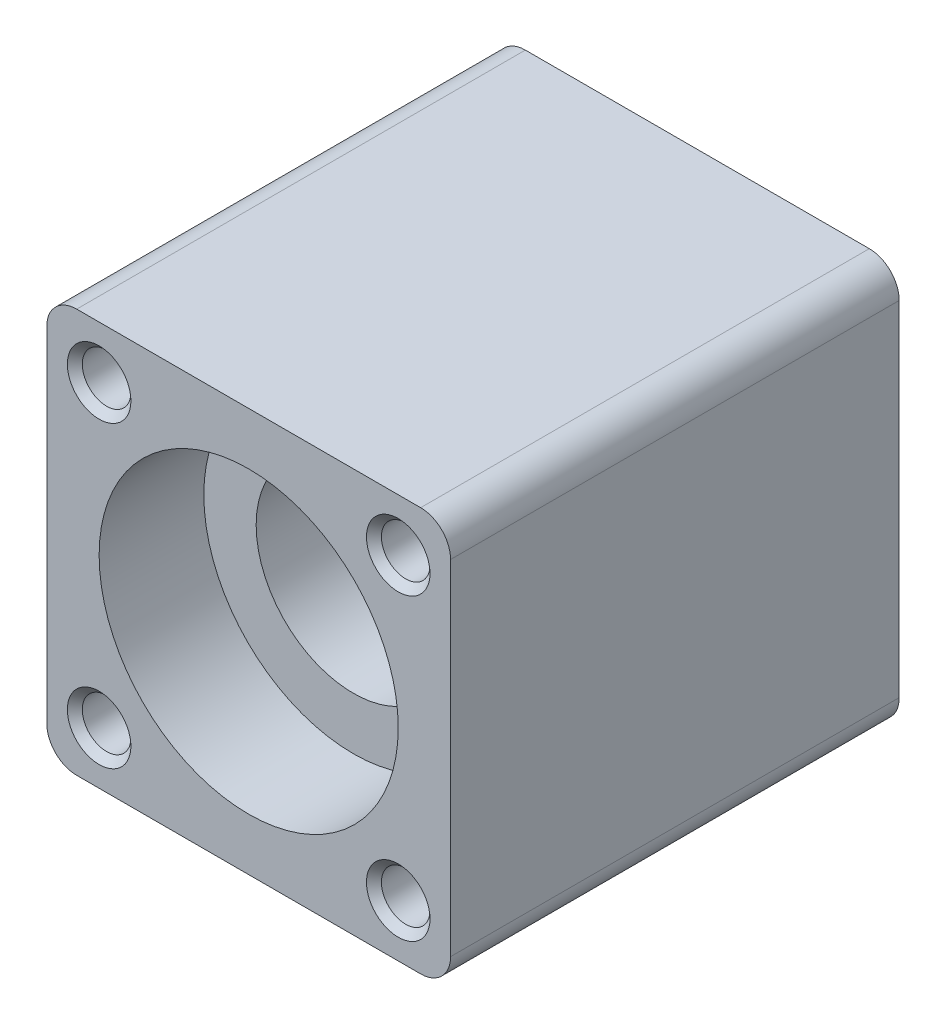
ISO-10303-21;
HEADER;
FILE_DESCRIPTION(('STEP AP214'),'2;1');
FILE_NAME('part.step','',(''),(''),'','','');
FILE_SCHEMA(('AUTOMOTIVE_DESIGN { 1 0 10303 214 1 1 1 1 }'));
ENDSEC;
DATA;
#1=APPLICATION_CONTEXT('core data for automotive mechanical design processes');
#2=APPLICATION_PROTOCOL_DEFINITION('international standard','automotive_design',2000,#1);
#3=PRODUCT_CONTEXT('',#1,'mechanical');
#4=PRODUCT('Part','Part','',(#3));
#5=PRODUCT_RELATED_PRODUCT_CATEGORY('part','',(#4));
#6=PRODUCT_DEFINITION_FORMATION('','',#4);
#7=PRODUCT_DEFINITION_CONTEXT('part definition',#1,'design');
#8=PRODUCT_DEFINITION('design','',#6,#7);
#9=PRODUCT_DEFINITION_SHAPE('','',#8);
#10=(LENGTH_UNIT() NAMED_UNIT(*) SI_UNIT(.MILLI.,.METRE.));
#11=(NAMED_UNIT(*) PLANE_ANGLE_UNIT() SI_UNIT($,.RADIAN.));
#12=(NAMED_UNIT(*) SI_UNIT($,.STERADIAN.) SOLID_ANGLE_UNIT());
#13=UNCERTAINTY_MEASURE_WITH_UNIT(LENGTH_MEASURE(1.E-05),#10,'distance_accuracy_value','');
#14=(GEOMETRIC_REPRESENTATION_CONTEXT(3) GLOBAL_UNCERTAINTY_ASSIGNED_CONTEXT((#13)) GLOBAL_UNIT_ASSIGNED_CONTEXT((#10,
#11,#12)) REPRESENTATION_CONTEXT('',''));
#15=CARTESIAN_POINT('',(0.,0.,0.));
#16=DIRECTION('',(0.,0.,1.));
#17=DIRECTION('',(1.,0.,0.));
#18=AXIS2_PLACEMENT_3D('',#15,#16,#17);
#19=CARTESIAN_POINT('',(0.,0.,0.));
#20=DIRECTION('',(0.,0.,1.));
#21=DIRECTION('',(1.,0.,0.));
#22=AXIS2_PLACEMENT_3D('',#19,#20,#21);
#23=CYLINDRICAL_SURFACE('',#22,13.);
#24=CARTESIAN_POINT('',(0.,0.,46.));
#25=DIRECTION('',(0.,0.,1.));
#26=DIRECTION('',(1.,0.,0.));
#27=AXIS2_PLACEMENT_3D('',#24,#25,#26);
#28=CIRCLE('',#27,13.);
#29=CARTESIAN_POINT('',(13.,0.,46.));
#30=VERTEX_POINT('',#29);
#31=EDGE_CURVE('E135',#30,#30,#28,.F.);
#32=ORIENTED_EDGE('',*,*,#31,.F.);
#33=EDGE_LOOP('',(#32));
#34=FACE_BOUND('',#33,.T.);
#35=CARTESIAN_POINT('',(0.,0.,12.));
#36=DIRECTION('',(0.,0.,-1.));
#37=DIRECTION('',(-1.,0.,0.));
#38=AXIS2_PLACEMENT_3D('',#35,#36,#37);
#39=CIRCLE('',#38,13.);
#40=CARTESIAN_POINT('',(-13.,0.,12.));
#41=VERTEX_POINT('',#40);
#42=EDGE_CURVE('E140',#41,#41,#39,.F.);
#43=ORIENTED_EDGE('',*,*,#42,.F.);
#44=EDGE_LOOP('',(#43));
#45=FACE_BOUND('',#44,.T.);
#46=ADVANCED_FACE('F33',(#34,#45),#23,.F.);
#47=CARTESIAN_POINT('',(27.,27.,60.));
#48=DIRECTION('',(-1.,0.,0.));
#49=DIRECTION('',(0.,-1.,0.));
#50=AXIS2_PLACEMENT_3D('',#47,#48,#49);
#51=PLANE('',#50);
#52=DIRECTION('',(0.,1.,0.));
#53=VECTOR('',#52,1.);
#54=CARTESIAN_POINT('',(27.,27.,60.));
#55=LINE('',#54,#53);
#56=CARTESIAN_POINT('',(27.,-23.,60.));
#57=VERTEX_POINT('',#56);
#58=CARTESIAN_POINT('',(27.,23.,60.));
#59=VERTEX_POINT('',#58);
#60=EDGE_CURVE('E126',#57,#59,#55,.T.);
#61=ORIENTED_EDGE('',*,*,#60,.F.);
#62=DIRECTION('',(0.,0.,-1.));
#63=VECTOR('',#62,1.);
#64=CARTESIAN_POINT('',(27.,-23.,60.));
#65=LINE('',#64,#63);
#66=CARTESIAN_POINT('',(27.,-23.,0.));
#67=VERTEX_POINT('',#66);
#68=EDGE_CURVE('E162',#57,#67,#65,.T.);
#69=ORIENTED_EDGE('',*,*,#68,.T.);
#70=DIRECTION('',(0.,1.,0.));
#71=VECTOR('',#70,1.);
#72=CARTESIAN_POINT('',(27.,27.,0.));
#73=LINE('',#72,#71);
#74=CARTESIAN_POINT('',(27.,23.,0.));
#75=VERTEX_POINT('',#74);
#76=EDGE_CURVE('E138',#67,#75,#73,.T.);
#77=ORIENTED_EDGE('',*,*,#76,.T.);
#78=DIRECTION('',(0.,0.,-1.));
#79=VECTOR('',#78,1.);
#80=CARTESIAN_POINT('',(27.,23.,60.));
#81=LINE('',#80,#79);
#82=EDGE_CURVE('E160',#75,#59,#81,.F.);
#83=ORIENTED_EDGE('',*,*,#82,.T.);
#84=EDGE_LOOP('',(#61,#69,#77,#83));
#85=FACE_BOUND('',#84,.T.);
#86=ADVANCED_FACE('F206',(#85),#51,.F.);
#87=CARTESIAN_POINT('',(-27.,27.,60.));
#88=DIRECTION('',(0.,-1.,0.));
#89=DIRECTION('',(0.,0.,-1.));
#90=AXIS2_PLACEMENT_3D('',#87,#88,#89);
#91=PLANE('',#90);
#92=DIRECTION('',(-1.,0.,0.));
#93=VECTOR('',#92,1.);
#94=CARTESIAN_POINT('',(-27.,27.,60.));
#95=LINE('',#94,#93);
#96=CARTESIAN_POINT('',(23.,27.,60.));
#97=VERTEX_POINT('',#96);
#98=CARTESIAN_POINT('',(-23.,27.,60.));
#99=VERTEX_POINT('',#98);
#100=EDGE_CURVE('E129',#97,#99,#95,.T.);
#101=ORIENTED_EDGE('',*,*,#100,.F.);
#102=DIRECTION('',(0.,0.,-1.));
#103=VECTOR('',#102,1.);
#104=CARTESIAN_POINT('',(23.,27.,60.));
#105=LINE('',#104,#103);
#106=CARTESIAN_POINT('',(23.,27.,0.));
#107=VERTEX_POINT('',#106);
#108=EDGE_CURVE('E166',#97,#107,#105,.T.);
#109=ORIENTED_EDGE('',*,*,#108,.T.);
#110=DIRECTION('',(-1.,0.,0.));
#111=VECTOR('',#110,1.);
#112=CARTESIAN_POINT('',(-27.,27.,0.));
#113=LINE('',#112,#111);
#114=CARTESIAN_POINT('',(-23.,27.,0.));
#115=VERTEX_POINT('',#114);
#116=EDGE_CURVE('E131',#107,#115,#113,.T.);
#117=ORIENTED_EDGE('',*,*,#116,.T.);
#118=DIRECTION('',(0.,0.,-1.));
#119=VECTOR('',#118,1.);
#120=CARTESIAN_POINT('',(-23.,27.,60.));
#121=LINE('',#120,#119);
#122=EDGE_CURVE('E48',#115,#99,#121,.F.);
#123=ORIENTED_EDGE('',*,*,#122,.T.);
#124=EDGE_LOOP('',(#101,#109,#117,#123));
#125=FACE_BOUND('',#124,.T.);
#126=ADVANCED_FACE('F212',(#125),#91,.F.);
#127=CARTESIAN_POINT('',(-27.,27.,60.));
#128=DIRECTION('',(1.,0.,0.));
#129=DIRECTION('',(0.,1.,0.));
#130=AXIS2_PLACEMENT_3D('',#127,#128,#129);
#131=PLANE('',#130);
#132=DIRECTION('',(0.,-1.,0.));
#133=VECTOR('',#132,1.);
#134=CARTESIAN_POINT('',(-27.,27.,0.));
#135=LINE('',#134,#133);
#136=CARTESIAN_POINT('',(-27.,23.,0.));
#137=VERTEX_POINT('',#136);
#138=CARTESIAN_POINT('',(-27.,-23.,0.));
#139=VERTEX_POINT('',#138);
#140=EDGE_CURVE('E127',#137,#139,#135,.T.);
#141=ORIENTED_EDGE('',*,*,#140,.T.);
#142=DIRECTION('',(0.,0.,-1.));
#143=VECTOR('',#142,1.);
#144=CARTESIAN_POINT('',(-27.,-23.,60.));
#145=LINE('',#144,#143);
#146=CARTESIAN_POINT('',(-27.,-23.,60.));
#147=VERTEX_POINT('',#146);
#148=EDGE_CURVE('E105',#139,#147,#145,.F.);
#149=ORIENTED_EDGE('',*,*,#148,.T.);
#150=DIRECTION('',(0.,-1.,0.));
#151=VECTOR('',#150,1.);
#152=CARTESIAN_POINT('',(-27.,27.,60.));
#153=LINE('',#152,#151);
#154=CARTESIAN_POINT('',(-27.,23.,60.));
#155=VERTEX_POINT('',#154);
#156=EDGE_CURVE('E290',#155,#147,#153,.T.);
#157=ORIENTED_EDGE('',*,*,#156,.F.);
#158=DIRECTION('',(0.,0.,-1.));
#159=VECTOR('',#158,1.);
#160=CARTESIAN_POINT('',(-27.,23.,60.));
#161=LINE('',#160,#159);
#162=EDGE_CURVE('E110',#155,#137,#161,.T.);
#163=ORIENTED_EDGE('',*,*,#162,.T.);
#164=EDGE_LOOP('',(#141,#149,#157,#163));
#165=FACE_BOUND('',#164,.T.);
#166=ADVANCED_FACE('F231',(#165),#131,.F.);
#167=CARTESIAN_POINT('',(-27.,-27.,60.));
#168=DIRECTION('',(0.,1.,0.));
#169=DIRECTION('',(0.,0.,1.));
#170=AXIS2_PLACEMENT_3D('',#167,#168,#169);
#171=PLANE('',#170);
#172=DIRECTION('',(1.,0.,0.));
#173=VECTOR('',#172,1.);
#174=CARTESIAN_POINT('',(-27.,-27.,60.));
#175=LINE('',#174,#173);
#176=CARTESIAN_POINT('',(-23.,-27.,60.));
#177=VERTEX_POINT('',#176);
#178=CARTESIAN_POINT('',(23.,-27.,60.));
#179=VERTEX_POINT('',#178);
#180=EDGE_CURVE('E120',#177,#179,#175,.T.);
#181=ORIENTED_EDGE('',*,*,#180,.F.);
#182=DIRECTION('',(0.,0.,-1.));
#183=VECTOR('',#182,1.);
#184=CARTESIAN_POINT('',(-23.,-27.,60.));
#185=LINE('',#184,#183);
#186=CARTESIAN_POINT('',(-23.,-27.,0.));
#187=VERTEX_POINT('',#186);
#188=EDGE_CURVE('E104',#177,#187,#185,.T.);
#189=ORIENTED_EDGE('',*,*,#188,.T.);
#190=DIRECTION('',(1.,0.,0.));
#191=VECTOR('',#190,1.);
#192=CARTESIAN_POINT('',(-27.,-27.,0.));
#193=LINE('',#192,#191);
#194=CARTESIAN_POINT('',(23.,-27.,0.));
#195=VERTEX_POINT('',#194);
#196=EDGE_CURVE('E117',#187,#195,#193,.T.);
#197=ORIENTED_EDGE('',*,*,#196,.T.);
#198=DIRECTION('',(0.,0.,-1.));
#199=VECTOR('',#198,1.);
#200=CARTESIAN_POINT('',(23.,-27.,60.));
#201=LINE('',#200,#199);
#202=EDGE_CURVE('E122',#195,#179,#201,.F.);
#203=ORIENTED_EDGE('',*,*,#202,.T.);
#204=EDGE_LOOP('',(#181,#189,#197,#203));
#205=FACE_BOUND('',#204,.T.);
#206=ADVANCED_FACE('F116',(#205),#171,.F.);
#207=CARTESIAN_POINT('',(0.,0.,60.));
#208=DIRECTION('',(0.,0.,1.));
#209=DIRECTION('',(1.,0.,0.));
#210=AXIS2_PLACEMENT_3D('',#207,#208,#209);
#211=PLANE('',#210);
#212=CARTESIAN_POINT('',(-19.9999999999989,-20.0000000000011,60.));
#213=DIRECTION('',(0.,0.,1.));
#214=DIRECTION('',(1.,0.,0.));
#215=AXIS2_PLACEMENT_3D('',#212,#213,#214);
#216=CIRCLE('',#215,4.25000000000085);
#217=CARTESIAN_POINT('',(-15.749999999998,-20.0000000000011,60.));
#218=VERTEX_POINT('',#217);
#219=EDGE_CURVE('E181',#218,#218,#216,.F.);
#220=ORIENTED_EDGE('',*,*,#219,.T.);
#221=EDGE_LOOP('',(#220));
#222=FACE_BOUND('',#221,.T.);
#223=CARTESIAN_POINT('',(20.0000000000011,-20.,60.));
#224=DIRECTION('',(0.,0.,1.));
#225=DIRECTION('',(1.,0.,0.));
#226=AXIS2_PLACEMENT_3D('',#223,#224,#225);
#227=CIRCLE('',#226,4.24999999999971);
#228=CARTESIAN_POINT('',(24.2500000000008,-20.,60.));
#229=VERTEX_POINT('',#228);
#230=EDGE_CURVE('E178',#229,#229,#227,.F.);
#231=ORIENTED_EDGE('',*,*,#230,.T.);
#232=EDGE_LOOP('',(#231));
#233=FACE_BOUND('',#232,.T.);
#234=CARTESIAN_POINT('',(20.,20.,60.));
#235=DIRECTION('',(0.,0.,1.));
#236=DIRECTION('',(1.,0.,0.));
#237=AXIS2_PLACEMENT_3D('',#234,#235,#236);
#238=CIRCLE('',#237,4.25000000000003);
#239=CARTESIAN_POINT('',(24.25,20.,60.));
#240=VERTEX_POINT('',#239);
#241=EDGE_CURVE('E175',#240,#240,#238,.F.);
#242=ORIENTED_EDGE('',*,*,#241,.T.);
#243=EDGE_LOOP('',(#242));
#244=FACE_BOUND('',#243,.T.);
#245=CARTESIAN_POINT('',(-20.,19.9999999999989,60.));
#246=DIRECTION('',(0.,0.,1.));
#247=DIRECTION('',(1.,0.,0.));
#248=AXIS2_PLACEMENT_3D('',#245,#246,#247);
#249=CIRCLE('',#248,4.25000000000124);
#250=CARTESIAN_POINT('',(-15.7499999999988,19.9999999999989,60.));
#251=VERTEX_POINT('',#250);
#252=EDGE_CURVE('E172',#251,#251,#249,.F.);
#253=ORIENTED_EDGE('',*,*,#252,.T.);
#254=EDGE_LOOP('',(#253));
#255=FACE_BOUND('',#254,.T.);
#256=CARTESIAN_POINT('',(0.,0.,60.));
#257=DIRECTION('',(0.,0.,1.));
#258=DIRECTION('',(1.,0.,0.));
#259=AXIS2_PLACEMENT_3D('',#256,#257,#258);
#260=CIRCLE('',#259,20.);
#261=CARTESIAN_POINT('',(20.,0.,60.));
#262=VERTEX_POINT('',#261);
#263=EDGE_CURVE('E143',#262,#262,#260,.T.);
#264=ORIENTED_EDGE('',*,*,#263,.F.);
#265=EDGE_LOOP('',(#264));
#266=FACE_BOUND('',#265,.T.);
#267=ORIENTED_EDGE('',*,*,#156,.T.);
#268=CARTESIAN_POINT('',(-23.,-23.,60.));
#269=DIRECTION('',(0.,0.,1.));
#270=DIRECTION('',(1.,0.,0.));
#271=AXIS2_PLACEMENT_3D('',#268,#269,#270);
#272=CIRCLE('',#271,4.);
#273=EDGE_CURVE('E158',#147,#177,#272,.T.);
#274=ORIENTED_EDGE('',*,*,#273,.T.);
#275=ORIENTED_EDGE('',*,*,#180,.T.);
#276=CARTESIAN_POINT('',(23.,-23.,60.));
#277=DIRECTION('',(0.,0.,1.));
#278=DIRECTION('',(1.,0.,0.));
#279=AXIS2_PLACEMENT_3D('',#276,#277,#278);
#280=CIRCLE('',#279,4.);
#281=EDGE_CURVE('E156',#179,#57,#280,.T.);
#282=ORIENTED_EDGE('',*,*,#281,.T.);
#283=ORIENTED_EDGE('',*,*,#60,.T.);
#284=CARTESIAN_POINT('',(23.,23.,60.));
#285=DIRECTION('',(0.,0.,1.));
#286=DIRECTION('',(1.,0.,0.));
#287=AXIS2_PLACEMENT_3D('',#284,#285,#286);
#288=CIRCLE('',#287,4.);
#289=EDGE_CURVE('E55',#59,#97,#288,.T.);
#290=ORIENTED_EDGE('',*,*,#289,.T.);
#291=ORIENTED_EDGE('',*,*,#100,.T.);
#292=CARTESIAN_POINT('',(-23.,23.,60.));
#293=DIRECTION('',(0.,0.,1.));
#294=DIRECTION('',(1.,0.,0.));
#295=AXIS2_PLACEMENT_3D('',#292,#293,#294);
#296=CIRCLE('',#295,4.);
#297=EDGE_CURVE('E153',#99,#155,#296,.T.);
#298=ORIENTED_EDGE('',*,*,#297,.T.);
#299=EDGE_LOOP('',(#267,#274,#275,#282,#283,#290,#291,#298));
#300=FACE_BOUND('',#299,.T.);
#301=ADVANCED_FACE('F221',(#222,#233,#244,#255,#266,#300),#211,.T.);
#302=CARTESIAN_POINT('',(0.,0.,0.));
#303=DIRECTION('',(0.,0.,1.));
#304=DIRECTION('',(1.,0.,0.));
#305=AXIS2_PLACEMENT_3D('',#302,#303,#304);
#306=PLANE('',#305);
#307=CARTESIAN_POINT('',(-20.,19.9999999999989,0.));
#308=DIRECTION('',(0.,0.,1.));
#309=DIRECTION('',(1.,0.,0.));
#310=AXIS2_PLACEMENT_3D('',#307,#308,#309);
#311=CIRCLE('',#310,3.25000000000121);
#312=CARTESIAN_POINT('',(-16.7499999999988,19.9999999999989,0.));
#313=VERTEX_POINT('',#312);
#314=EDGE_CURVE('E270',#313,#313,#311,.T.);
#315=ORIENTED_EDGE('',*,*,#314,.T.);
#316=EDGE_LOOP('',(#315));
#317=FACE_BOUND('',#316,.T.);
#318=CARTESIAN_POINT('',(-19.9999999999989,-20.0000000000011,0.));
#319=DIRECTION('',(0.,0.,1.));
#320=DIRECTION('',(1.,0.,0.));
#321=AXIS2_PLACEMENT_3D('',#318,#319,#320);
#322=CIRCLE('',#321,3.25000000000083);
#323=CARTESIAN_POINT('',(-16.749999999998,-20.0000000000011,0.));
#324=VERTEX_POINT('',#323);
#325=EDGE_CURVE('E267',#324,#324,#322,.T.);
#326=ORIENTED_EDGE('',*,*,#325,.T.);
#327=EDGE_LOOP('',(#326));
#328=FACE_BOUND('',#327,.T.);
#329=CARTESIAN_POINT('',(20.0000000000011,-20.,0.));
#330=DIRECTION('',(0.,0.,1.));
#331=DIRECTION('',(1.,0.,0.));
#332=AXIS2_PLACEMENT_3D('',#329,#330,#331);
#333=CIRCLE('',#332,3.24999999999972);
#334=CARTESIAN_POINT('',(23.2500000000008,-20.,0.));
#335=VERTEX_POINT('',#334);
#336=EDGE_CURVE('E269',#335,#335,#333,.T.);
#337=ORIENTED_EDGE('',*,*,#336,.T.);
#338=EDGE_LOOP('',(#337));
#339=FACE_BOUND('',#338,.T.);
#340=CARTESIAN_POINT('',(20.,20.,0.));
#341=DIRECTION('',(0.,0.,1.));
#342=DIRECTION('',(1.,0.,0.));
#343=AXIS2_PLACEMENT_3D('',#340,#341,#342);
#344=CIRCLE('',#343,3.25);
#345=CARTESIAN_POINT('',(23.25,20.,0.));
#346=VERTEX_POINT('',#345);
#347=EDGE_CURVE('E273',#346,#346,#344,.T.);
#348=ORIENTED_EDGE('',*,*,#347,.T.);
#349=EDGE_LOOP('',(#348));
#350=FACE_BOUND('',#349,.T.);
#351=CARTESIAN_POINT('',(0.,0.,0.));
#352=DIRECTION('',(0.,0.,-1.));
#353=DIRECTION('',(-1.,0.,0.));
#354=AXIS2_PLACEMENT_3D('',#351,#352,#353);
#355=CIRCLE('',#354,20.);
#356=CARTESIAN_POINT('',(-20.,0.,0.));
#357=VERTEX_POINT('',#356);
#358=EDGE_CURVE('E280',#357,#357,#355,.T.);
#359=ORIENTED_EDGE('',*,*,#358,.F.);
#360=EDGE_LOOP('',(#359));
#361=FACE_BOUND('',#360,.T.);
#362=ORIENTED_EDGE('',*,*,#196,.F.);
#363=CARTESIAN_POINT('',(-23.,-23.,0.));
#364=DIRECTION('',(0.,0.,1.));
#365=DIRECTION('',(1.,0.,0.));
#366=AXIS2_PLACEMENT_3D('',#363,#364,#365);
#367=CIRCLE('',#366,4.);
#368=EDGE_CURVE('E100',#187,#139,#367,.F.);
#369=ORIENTED_EDGE('',*,*,#368,.T.);
#370=ORIENTED_EDGE('',*,*,#140,.F.);
#371=CARTESIAN_POINT('',(-23.,23.,0.));
#372=DIRECTION('',(0.,0.,1.));
#373=DIRECTION('',(1.,0.,0.));
#374=AXIS2_PLACEMENT_3D('',#371,#372,#373);
#375=CIRCLE('',#374,4.);
#376=EDGE_CURVE('E121',#137,#115,#375,.F.);
#377=ORIENTED_EDGE('',*,*,#376,.T.);
#378=ORIENTED_EDGE('',*,*,#116,.F.);
#379=CARTESIAN_POINT('',(23.,23.,0.));
#380=DIRECTION('',(0.,0.,1.));
#381=DIRECTION('',(1.,0.,0.));
#382=AXIS2_PLACEMENT_3D('',#379,#380,#381);
#383=CIRCLE('',#382,4.);
#384=EDGE_CURVE('E147',#107,#75,#383,.F.);
#385=ORIENTED_EDGE('',*,*,#384,.T.);
#386=ORIENTED_EDGE('',*,*,#76,.F.);
#387=CARTESIAN_POINT('',(23.,-23.,0.));
#388=DIRECTION('',(0.,0.,1.));
#389=DIRECTION('',(1.,0.,0.));
#390=AXIS2_PLACEMENT_3D('',#387,#388,#389);
#391=CIRCLE('',#390,4.);
#392=EDGE_CURVE('E111',#67,#195,#391,.F.);
#393=ORIENTED_EDGE('',*,*,#392,.T.);
#394=EDGE_LOOP('',(#362,#369,#370,#377,#378,#385,#386,#393));
#395=FACE_BOUND('',#394,.T.);
#396=ADVANCED_FACE('F124',(#317,#328,#339,#350,#361,#395),#306,.F.);
#397=CARTESIAN_POINT('',(0.,0.,46.));
#398=DIRECTION('',(0.,0.,1.));
#399=DIRECTION('',(1.,0.,0.));
#400=AXIS2_PLACEMENT_3D('',#397,#398,#399);
#401=PLANE('',#400);
#402=CARTESIAN_POINT('',(0.,0.,46.));
#403=DIRECTION('',(0.,0.,1.));
#404=DIRECTION('',(1.,0.,0.));
#405=AXIS2_PLACEMENT_3D('',#402,#403,#404);
#406=CIRCLE('',#405,20.);
#407=CARTESIAN_POINT('',(20.,0.,46.));
#408=VERTEX_POINT('',#407);
#409=EDGE_CURVE('E139',#408,#408,#406,.T.);
#410=ORIENTED_EDGE('',*,*,#409,.T.);
#411=EDGE_LOOP('',(#410));
#412=FACE_BOUND('',#411,.T.);
#413=ORIENTED_EDGE('',*,*,#31,.T.);
#414=EDGE_LOOP('',(#413));
#415=FACE_BOUND('',#414,.T.);
#416=ADVANCED_FACE('F227',(#412,#415),#401,.T.);
#417=CARTESIAN_POINT('',(0.,0.,46.));
#418=DIRECTION('',(0.,0.,1.));
#419=DIRECTION('',(1.,0.,0.));
#420=AXIS2_PLACEMENT_3D('',#417,#418,#419);
#421=CYLINDRICAL_SURFACE('',#420,20.);
#422=ORIENTED_EDGE('',*,*,#409,.F.);
#423=EDGE_LOOP('',(#422));
#424=FACE_BOUND('',#423,.T.);
#425=ORIENTED_EDGE('',*,*,#263,.T.);
#426=EDGE_LOOP('',(#425));
#427=FACE_BOUND('',#426,.T.);
#428=ADVANCED_FACE('F219',(#424,#427),#421,.F.);
#429=CARTESIAN_POINT('',(0.,0.,12.));
#430=DIRECTION('',(0.,0.,-1.));
#431=DIRECTION('',(-1.,0.,0.));
#432=AXIS2_PLACEMENT_3D('',#429,#430,#431);
#433=PLANE('',#432);
#434=CARTESIAN_POINT('',(0.,0.,12.));
#435=DIRECTION('',(0.,0.,-1.));
#436=DIRECTION('',(-1.,0.,0.));
#437=AXIS2_PLACEMENT_3D('',#434,#435,#436);
#438=CIRCLE('',#437,20.);
#439=CARTESIAN_POINT('',(-20.,0.,12.));
#440=VERTEX_POINT('',#439);
#441=EDGE_CURVE('E144',#440,#440,#438,.T.);
#442=ORIENTED_EDGE('',*,*,#441,.T.);
#443=EDGE_LOOP('',(#442));
#444=FACE_BOUND('',#443,.T.);
#445=ORIENTED_EDGE('',*,*,#42,.T.);
#446=EDGE_LOOP('',(#445));
#447=FACE_BOUND('',#446,.T.);
#448=ADVANCED_FACE('F308',(#444,#447),#433,.T.);
#449=CARTESIAN_POINT('',(0.,0.,12.));
#450=DIRECTION('',(0.,0.,-1.));
#451=DIRECTION('',(-1.,0.,0.));
#452=AXIS2_PLACEMENT_3D('',#449,#450,#451);
#453=CYLINDRICAL_SURFACE('',#452,20.);
#454=ORIENTED_EDGE('',*,*,#441,.F.);
#455=EDGE_LOOP('',(#454));
#456=FACE_BOUND('',#455,.T.);
#457=ORIENTED_EDGE('',*,*,#358,.T.);
#458=EDGE_LOOP('',(#457));
#459=FACE_BOUND('',#458,.T.);
#460=ADVANCED_FACE('F314',(#456,#459),#453,.F.);
#461=CARTESIAN_POINT('',(20.,20.,0.));
#462=DIRECTION('',(0.,0.,1.));
#463=DIRECTION('',(1.,0.,0.));
#464=AXIS2_PLACEMENT_3D('',#461,#462,#463);
#465=CYLINDRICAL_SURFACE('',#464,3.25);
#466=CARTESIAN_POINT('',(20.,20.,59.));
#467=DIRECTION('',(0.,0.,1.));
#468=DIRECTION('',(1.,0.,0.));
#469=AXIS2_PLACEMENT_3D('',#466,#467,#468);
#470=CIRCLE('',#469,3.25);
#471=CARTESIAN_POINT('',(23.25,20.,59.));
#472=VERTEX_POINT('',#471);
#473=EDGE_CURVE('E41',#472,#472,#470,.T.);
#474=ORIENTED_EDGE('',*,*,#473,.T.);
#475=EDGE_LOOP('',(#474));
#476=FACE_BOUND('',#475,.T.);
#477=ORIENTED_EDGE('',*,*,#347,.F.);
#478=EDGE_LOOP('',(#477));
#479=FACE_BOUND('',#478,.T.);
#480=ADVANCED_FACE('F189',(#476,#479),#465,.F.);
#481=CARTESIAN_POINT('',(20.0000000000011,-20.,0.));
#482=DIRECTION('',(0.,0.,1.));
#483=DIRECTION('',(1.,0.,0.));
#484=AXIS2_PLACEMENT_3D('',#481,#482,#483);
#485=CYLINDRICAL_SURFACE('',#484,3.24999999999972);
#486=CARTESIAN_POINT('',(20.0000000000011,-20.,59.));
#487=DIRECTION('',(0.,0.,1.));
#488=DIRECTION('',(1.,0.,0.));
#489=AXIS2_PLACEMENT_3D('',#486,#487,#488);
#490=CIRCLE('',#489,3.24999999999972);
#491=CARTESIAN_POINT('',(23.2500000000008,-20.,59.));
#492=VERTEX_POINT('',#491);
#493=EDGE_CURVE('E184',#492,#492,#490,.T.);
#494=ORIENTED_EDGE('',*,*,#493,.T.);
#495=EDGE_LOOP('',(#494));
#496=FACE_BOUND('',#495,.T.);
#497=ORIENTED_EDGE('',*,*,#336,.F.);
#498=EDGE_LOOP('',(#497));
#499=FACE_BOUND('',#498,.T.);
#500=ADVANCED_FACE('F263',(#496,#499),#485,.F.);
#501=CARTESIAN_POINT('',(-19.9999999999989,-20.0000000000011,0.));
#502=DIRECTION('',(0.,0.,1.));
#503=DIRECTION('',(1.,0.,0.));
#504=AXIS2_PLACEMENT_3D('',#501,#502,#503);
#505=CYLINDRICAL_SURFACE('',#504,3.25000000000083);
#506=CARTESIAN_POINT('',(-19.9999999999989,-20.0000000000011,59.));
#507=DIRECTION('',(0.,0.,1.));
#508=DIRECTION('',(1.,0.,0.));
#509=AXIS2_PLACEMENT_3D('',#506,#507,#508);
#510=CIRCLE('',#509,3.25000000000083);
#511=CARTESIAN_POINT('',(-16.749999999998,-20.0000000000011,59.));
#512=VERTEX_POINT('',#511);
#513=EDGE_CURVE('E169',#512,#512,#510,.T.);
#514=ORIENTED_EDGE('',*,*,#513,.T.);
#515=EDGE_LOOP('',(#514));
#516=FACE_BOUND('',#515,.T.);
#517=ORIENTED_EDGE('',*,*,#325,.F.);
#518=EDGE_LOOP('',(#517));
#519=FACE_BOUND('',#518,.T.);
#520=ADVANCED_FACE('F260',(#516,#519),#505,.F.);
#521=CARTESIAN_POINT('',(-20.,19.9999999999989,0.));
#522=DIRECTION('',(0.,0.,1.));
#523=DIRECTION('',(1.,0.,0.));
#524=AXIS2_PLACEMENT_3D('',#521,#522,#523);
#525=CYLINDRICAL_SURFACE('',#524,3.25000000000121);
#526=CARTESIAN_POINT('',(-20.,19.9999999999989,59.));
#527=DIRECTION('',(0.,0.,1.));
#528=DIRECTION('',(1.,0.,0.));
#529=AXIS2_PLACEMENT_3D('',#526,#527,#528);
#530=CIRCLE('',#529,3.25000000000121);
#531=CARTESIAN_POINT('',(-16.7499999999988,19.9999999999989,59.));
#532=VERTEX_POINT('',#531);
#533=EDGE_CURVE('E11',#532,#532,#530,.T.);
#534=ORIENTED_EDGE('',*,*,#533,.T.);
#535=EDGE_LOOP('',(#534));
#536=FACE_BOUND('',#535,.T.);
#537=ORIENTED_EDGE('',*,*,#314,.F.);
#538=EDGE_LOOP('',(#537));
#539=FACE_BOUND('',#538,.T.);
#540=ADVANCED_FACE('F240',(#536,#539),#525,.F.);
#541=CARTESIAN_POINT('',(-23.,-23.,60.));
#542=DIRECTION('',(0.,0.,-1.));
#543=DIRECTION('',(-1.,0.,0.));
#544=AXIS2_PLACEMENT_3D('',#541,#542,#543);
#545=CYLINDRICAL_SURFACE('',#544,4.);
#546=ORIENTED_EDGE('',*,*,#273,.F.);
#547=ORIENTED_EDGE('',*,*,#148,.F.);
#548=ORIENTED_EDGE('',*,*,#368,.F.);
#549=ORIENTED_EDGE('',*,*,#188,.F.);
#550=EDGE_LOOP('',(#546,#547,#548,#549));
#551=FACE_BOUND('',#550,.T.);
#552=ADVANCED_FACE('F103',(#551),#545,.T.);
#553=CARTESIAN_POINT('',(23.,-23.,60.));
#554=DIRECTION('',(0.,0.,-1.));
#555=DIRECTION('',(-1.,0.,0.));
#556=AXIS2_PLACEMENT_3D('',#553,#554,#555);
#557=CYLINDRICAL_SURFACE('',#556,4.);
#558=ORIENTED_EDGE('',*,*,#281,.F.);
#559=ORIENTED_EDGE('',*,*,#202,.F.);
#560=ORIENTED_EDGE('',*,*,#392,.F.);
#561=ORIENTED_EDGE('',*,*,#68,.F.);
#562=EDGE_LOOP('',(#558,#559,#560,#561));
#563=FACE_BOUND('',#562,.T.);
#564=ADVANCED_FACE('F239',(#563),#557,.T.);
#565=CARTESIAN_POINT('',(23.,23.,60.));
#566=DIRECTION('',(0.,0.,-1.));
#567=DIRECTION('',(-1.,0.,0.));
#568=AXIS2_PLACEMENT_3D('',#565,#566,#567);
#569=CYLINDRICAL_SURFACE('',#568,4.);
#570=ORIENTED_EDGE('',*,*,#289,.F.);
#571=ORIENTED_EDGE('',*,*,#82,.F.);
#572=ORIENTED_EDGE('',*,*,#384,.F.);
#573=ORIENTED_EDGE('',*,*,#108,.F.);
#574=EDGE_LOOP('',(#570,#571,#572,#573));
#575=FACE_BOUND('',#574,.T.);
#576=ADVANCED_FACE('F243',(#575),#569,.T.);
#577=CARTESIAN_POINT('',(-23.,23.,60.));
#578=DIRECTION('',(0.,0.,-1.));
#579=DIRECTION('',(-1.,0.,0.));
#580=AXIS2_PLACEMENT_3D('',#577,#578,#579);
#581=CYLINDRICAL_SURFACE('',#580,4.);
#582=ORIENTED_EDGE('',*,*,#297,.F.);
#583=ORIENTED_EDGE('',*,*,#122,.F.);
#584=ORIENTED_EDGE('',*,*,#376,.F.);
#585=ORIENTED_EDGE('',*,*,#162,.F.);
#586=EDGE_LOOP('',(#582,#583,#584,#585));
#587=FACE_BOUND('',#586,.T.);
#588=ADVANCED_FACE('F247',(#587),#581,.T.);
#589=CARTESIAN_POINT('',(-19.9999999999989,-20.0000000000011,59.));
#590=DIRECTION('',(0.,0.,1.));
#591=DIRECTION('',(1.,0.,0.));
#592=AXIS2_PLACEMENT_3D('',#589,#590,#591);
#593=CONICAL_SURFACE('',#592,3.25000000000083,0.785398163397453);
#594=ORIENTED_EDGE('',*,*,#219,.F.);
#595=EDGE_LOOP('',(#594));
#596=FACE_BOUND('',#595,.T.);
#597=ORIENTED_EDGE('',*,*,#513,.F.);
#598=EDGE_LOOP('',(#597));
#599=FACE_BOUND('',#598,.T.);
#600=ADVANCED_FACE('F201',(#596,#599),#593,.F.);
#601=CARTESIAN_POINT('',(20.0000000000011,-20.,59.));
#602=DIRECTION('',(0.,0.,1.));
#603=DIRECTION('',(1.,0.,0.));
#604=AXIS2_PLACEMENT_3D('',#601,#602,#603);
#605=CONICAL_SURFACE('',#604,3.24999999999972,0.785398163397453);
#606=ORIENTED_EDGE('',*,*,#230,.F.);
#607=EDGE_LOOP('',(#606));
#608=FACE_BOUND('',#607,.T.);
#609=ORIENTED_EDGE('',*,*,#493,.F.);
#610=EDGE_LOOP('',(#609));
#611=FACE_BOUND('',#610,.T.);
#612=ADVANCED_FACE('F194',(#608,#611),#605,.F.);
#613=CARTESIAN_POINT('',(20.,20.,59.));
#614=DIRECTION('',(0.,0.,1.));
#615=DIRECTION('',(1.,0.,0.));
#616=AXIS2_PLACEMENT_3D('',#613,#614,#615);
#617=CONICAL_SURFACE('',#616,3.25,0.78539816339746);
#618=ORIENTED_EDGE('',*,*,#241,.F.);
#619=EDGE_LOOP('',(#618));
#620=FACE_BOUND('',#619,.T.);
#621=ORIENTED_EDGE('',*,*,#473,.F.);
#622=EDGE_LOOP('',(#621));
#623=FACE_BOUND('',#622,.T.);
#624=ADVANCED_FACE('F192',(#620,#623),#617,.F.);
#625=CARTESIAN_POINT('',(-20.,19.9999999999989,59.));
#626=DIRECTION('',(0.,0.,1.));
#627=DIRECTION('',(1.,0.,0.));
#628=AXIS2_PLACEMENT_3D('',#625,#626,#627);
#629=CONICAL_SURFACE('',#628,3.25000000000121,0.785398163397454);
#630=ORIENTED_EDGE('',*,*,#252,.F.);
#631=EDGE_LOOP('',(#630));
#632=FACE_BOUND('',#631,.T.);
#633=ORIENTED_EDGE('',*,*,#533,.F.);
#634=EDGE_LOOP('',(#633));
#635=FACE_BOUND('',#634,.T.);
#636=ADVANCED_FACE('F35',(#632,#635),#629,.F.);
#637=CLOSED_SHELL('',(#46,#86,#126,#166,#206,#301,#396,#416,#428,#448,#460,#480,#500,#520,#540,
#552,#564,#576,#588,#600,#612,#624,#636));
#638=MANIFOLD_SOLID_BREP('B2',#637);
#639=ADVANCED_BREP_SHAPE_REPRESENTATION('',(#18,#638),#14);
#640=SHAPE_DEFINITION_REPRESENTATION(#9,#639);
ENDSEC;
END-ISO-10303-21;
